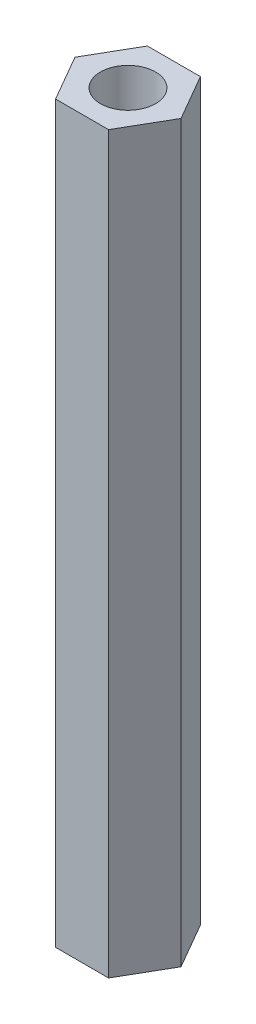
ISO-10303-21;
HEADER;
FILE_DESCRIPTION(('STEP AP214'),'2;1');
FILE_NAME('part.step','',(''),(''),'','','');
FILE_SCHEMA(('AUTOMOTIVE_DESIGN { 1 0 10303 214 1 1 1 1 }'));
ENDSEC;
DATA;
#1=APPLICATION_CONTEXT('core data for automotive mechanical design processes');
#2=APPLICATION_PROTOCOL_DEFINITION('international standard','automotive_design',2000,#1);
#3=PRODUCT_CONTEXT('',#1,'mechanical');
#4=PRODUCT('Part','Part','',(#3));
#5=PRODUCT_RELATED_PRODUCT_CATEGORY('part','',(#4));
#6=PRODUCT_DEFINITION_FORMATION('','',#4);
#7=PRODUCT_DEFINITION_CONTEXT('part definition',#1,'design');
#8=PRODUCT_DEFINITION('design','',#6,#7);
#9=PRODUCT_DEFINITION_SHAPE('','',#8);
#10=(LENGTH_UNIT() NAMED_UNIT(*) SI_UNIT(.MILLI.,.METRE.));
#11=(NAMED_UNIT(*) PLANE_ANGLE_UNIT() SI_UNIT($,.RADIAN.));
#12=(NAMED_UNIT(*) SI_UNIT($,.STERADIAN.) SOLID_ANGLE_UNIT());
#13=UNCERTAINTY_MEASURE_WITH_UNIT(LENGTH_MEASURE(1.E-05),#10,'distance_accuracy_value','');
#14=(GEOMETRIC_REPRESENTATION_CONTEXT(3) GLOBAL_UNCERTAINTY_ASSIGNED_CONTEXT((#13)) GLOBAL_UNIT_ASSIGNED_CONTEXT((#10,
#11,#12)) REPRESENTATION_CONTEXT('',''));
#15=CARTESIAN_POINT('',(0.,0.,0.));
#16=DIRECTION('',(0.,0.,1.));
#17=DIRECTION('',(1.,0.,0.));
#18=AXIS2_PLACEMENT_3D('',#15,#16,#17);
#19=CARTESIAN_POINT('',(1.44337567297407,20.,2.5));
#20=DIRECTION('',(-0.866025403784439,0.,-0.5));
#21=DIRECTION('',(-0.5,0.,0.866025403784439));
#22=AXIS2_PLACEMENT_3D('',#19,#20,#21);
#23=PLANE('',#22);
#24=DIRECTION('',(0.5,0.,-0.866025403784439));
#25=VECTOR('',#24,1.);
#26=CARTESIAN_POINT('',(1.44337567297407,-20.,2.5));
#27=LINE('',#26,#25);
#28=CARTESIAN_POINT('',(1.44337567297407,-20.,2.5));
#29=VERTEX_POINT('',#28);
#30=CARTESIAN_POINT('',(2.88675134594813,-20.,0.));
#31=VERTEX_POINT('',#30);
#32=EDGE_CURVE('E124',#29,#31,#27,.T.);
#33=ORIENTED_EDGE('',*,*,#32,.T.);
#34=DIRECTION('',(0.,-1.,0.));
#35=VECTOR('',#34,1.);
#36=CARTESIAN_POINT('',(2.88675134594813,20.,0.));
#37=LINE('',#36,#35);
#38=CARTESIAN_POINT('',(2.88675134594813,20.,0.));
#39=VERTEX_POINT('',#38);
#40=EDGE_CURVE('E11',#39,#31,#37,.T.);
#41=ORIENTED_EDGE('',*,*,#40,.F.);
#42=DIRECTION('',(0.5,0.,-0.866025403784439));
#43=VECTOR('',#42,1.);
#44=CARTESIAN_POINT('',(1.44337567297407,20.,2.5));
#45=LINE('',#44,#43);
#46=CARTESIAN_POINT('',(1.44337567297407,20.,2.5));
#47=VERTEX_POINT('',#46);
#48=EDGE_CURVE('E135',#47,#39,#45,.T.);
#49=ORIENTED_EDGE('',*,*,#48,.F.);
#50=DIRECTION('',(0.,-1.,0.));
#51=VECTOR('',#50,1.);
#52=CARTESIAN_POINT('',(1.44337567297407,20.,2.5));
#53=LINE('',#52,#51);
#54=EDGE_CURVE('E120',#47,#29,#53,.T.);
#55=ORIENTED_EDGE('',*,*,#54,.T.);
#56=EDGE_LOOP('',(#33,#41,#49,#55));
#57=FACE_BOUND('',#56,.T.);
#58=ADVANCED_FACE('F40',(#57),#23,.F.);
#59=CARTESIAN_POINT('',(2.88675134594813,20.,0.));
#60=DIRECTION('',(-0.866025403784438,0.,0.5));
#61=DIRECTION('',(0.5,0.,0.866025403784439));
#62=AXIS2_PLACEMENT_3D('',#59,#60,#61);
#63=PLANE('',#62);
#64=DIRECTION('',(-0.5,0.,-0.866025403784439));
#65=VECTOR('',#64,1.);
#66=CARTESIAN_POINT('',(2.88675134594813,-20.,0.));
#67=LINE('',#66,#65);
#68=CARTESIAN_POINT('',(1.44337567297406,-20.,-2.5));
#69=VERTEX_POINT('',#68);
#70=EDGE_CURVE('E127',#31,#69,#67,.T.);
#71=ORIENTED_EDGE('',*,*,#70,.T.);
#72=DIRECTION('',(0.,-1.,0.));
#73=VECTOR('',#72,1.);
#74=CARTESIAN_POINT('',(1.44337567297406,20.,-2.5));
#75=LINE('',#74,#73);
#76=CARTESIAN_POINT('',(1.44337567297406,20.,-2.5));
#77=VERTEX_POINT('',#76);
#78=EDGE_CURVE('E48',#77,#69,#75,.T.);
#79=ORIENTED_EDGE('',*,*,#78,.F.);
#80=DIRECTION('',(-0.5,0.,-0.866025403784439));
#81=VECTOR('',#80,1.);
#82=CARTESIAN_POINT('',(2.88675134594813,20.,0.));
#83=LINE('',#82,#81);
#84=EDGE_CURVE('E93',#39,#77,#83,.T.);
#85=ORIENTED_EDGE('',*,*,#84,.F.);
#86=ORIENTED_EDGE('',*,*,#40,.T.);
#87=EDGE_LOOP('',(#71,#79,#85,#86));
#88=FACE_BOUND('',#87,.T.);
#89=ADVANCED_FACE('F160',(#88),#63,.F.);
#90=CARTESIAN_POINT('',(1.44337567297406,20.,-2.5));
#91=DIRECTION('',(0.,0.,1.));
#92=DIRECTION('',(1.,0.,0.));
#93=AXIS2_PLACEMENT_3D('',#90,#91,#92);
#94=PLANE('',#93);
#95=DIRECTION('',(-1.,0.,0.));
#96=VECTOR('',#95,1.);
#97=CARTESIAN_POINT('',(1.44337567297406,-20.,-2.5));
#98=LINE('',#97,#96);
#99=CARTESIAN_POINT('',(-1.44337567297406,-20.,-2.5));
#100=VERTEX_POINT('',#99);
#101=EDGE_CURVE('E130',#69,#100,#98,.T.);
#102=ORIENTED_EDGE('',*,*,#101,.T.);
#103=DIRECTION('',(0.,-1.,0.));
#104=VECTOR('',#103,1.);
#105=CARTESIAN_POINT('',(-1.44337567297406,20.,-2.5));
#106=LINE('',#105,#104);
#107=CARTESIAN_POINT('',(-1.44337567297406,20.,-2.5));
#108=VERTEX_POINT('',#107);
#109=EDGE_CURVE('E115',#108,#100,#106,.T.);
#110=ORIENTED_EDGE('',*,*,#109,.F.);
#111=DIRECTION('',(-1.,0.,0.));
#112=VECTOR('',#111,1.);
#113=CARTESIAN_POINT('',(1.44337567297406,20.,-2.5));
#114=LINE('',#113,#112);
#115=EDGE_CURVE('E106',#77,#108,#114,.T.);
#116=ORIENTED_EDGE('',*,*,#115,.F.);
#117=ORIENTED_EDGE('',*,*,#78,.T.);
#118=EDGE_LOOP('',(#102,#110,#116,#117));
#119=FACE_BOUND('',#118,.T.);
#120=ADVANCED_FACE('F141',(#119),#94,.F.);
#121=CARTESIAN_POINT('',(-1.44337567297406,20.,-2.5));
#122=DIRECTION('',(0.866025403784439,0.,0.5));
#123=DIRECTION('',(0.5,0.,-0.866025403784439));
#124=AXIS2_PLACEMENT_3D('',#121,#122,#123);
#125=PLANE('',#124);
#126=DIRECTION('',(-0.5,0.,0.866025403784439));
#127=VECTOR('',#126,1.);
#128=CARTESIAN_POINT('',(-1.44337567297406,-20.,-2.5));
#129=LINE('',#128,#127);
#130=CARTESIAN_POINT('',(-2.88675134594813,-20.,0.));
#131=VERTEX_POINT('',#130);
#132=EDGE_CURVE('E114',#100,#131,#129,.T.);
#133=ORIENTED_EDGE('',*,*,#132,.T.);
#134=DIRECTION('',(0.,-1.,0.));
#135=VECTOR('',#134,1.);
#136=CARTESIAN_POINT('',(-2.88675134594813,20.,0.));
#137=LINE('',#136,#135);
#138=CARTESIAN_POINT('',(-2.88675134594813,20.,0.));
#139=VERTEX_POINT('',#138);
#140=EDGE_CURVE('E111',#139,#131,#137,.T.);
#141=ORIENTED_EDGE('',*,*,#140,.F.);
#142=DIRECTION('',(-0.5,0.,0.866025403784439));
#143=VECTOR('',#142,1.);
#144=CARTESIAN_POINT('',(-1.44337567297406,20.,-2.5));
#145=LINE('',#144,#143);
#146=EDGE_CURVE('E100',#108,#139,#145,.T.);
#147=ORIENTED_EDGE('',*,*,#146,.F.);
#148=ORIENTED_EDGE('',*,*,#109,.T.);
#149=EDGE_LOOP('',(#133,#141,#147,#148));
#150=FACE_BOUND('',#149,.T.);
#151=ADVANCED_FACE('F112',(#150),#125,.F.);
#152=CARTESIAN_POINT('',(-2.88675134594813,20.,0.));
#153=DIRECTION('',(0.866025403784438,0.,-0.5));
#154=DIRECTION('',(-0.5,0.,-0.866025403784439));
#155=AXIS2_PLACEMENT_3D('',#152,#153,#154);
#156=PLANE('',#155);
#157=DIRECTION('',(0.5,0.,0.866025403784439));
#158=VECTOR('',#157,1.);
#159=CARTESIAN_POINT('',(-2.88675134594813,-20.,0.));
#160=LINE('',#159,#158);
#161=CARTESIAN_POINT('',(-1.44337567297406,-20.,2.5));
#162=VERTEX_POINT('',#161);
#163=EDGE_CURVE('E79',#131,#162,#160,.T.);
#164=ORIENTED_EDGE('',*,*,#163,.T.);
#165=DIRECTION('',(0.,-1.,0.));
#166=VECTOR('',#165,1.);
#167=CARTESIAN_POINT('',(-1.44337567297406,20.,2.5));
#168=LINE('',#167,#166);
#169=CARTESIAN_POINT('',(-1.44337567297406,20.,2.5));
#170=VERTEX_POINT('',#169);
#171=EDGE_CURVE('E116',#170,#162,#168,.T.);
#172=ORIENTED_EDGE('',*,*,#171,.F.);
#173=DIRECTION('',(0.5,0.,0.866025403784439));
#174=VECTOR('',#173,1.);
#175=CARTESIAN_POINT('',(-2.88675134594813,20.,0.));
#176=LINE('',#175,#174);
#177=EDGE_CURVE('E104',#139,#170,#176,.T.);
#178=ORIENTED_EDGE('',*,*,#177,.F.);
#179=ORIENTED_EDGE('',*,*,#140,.T.);
#180=EDGE_LOOP('',(#164,#172,#178,#179));
#181=FACE_BOUND('',#180,.T.);
#182=ADVANCED_FACE('F118',(#181),#156,.F.);
#183=CARTESIAN_POINT('',(-1.44337567297406,20.,2.5));
#184=DIRECTION('',(0.,0.,-1.));
#185=DIRECTION('',(-1.,0.,0.));
#186=AXIS2_PLACEMENT_3D('',#183,#184,#185);
#187=PLANE('',#186);
#188=DIRECTION('',(1.,0.,0.));
#189=VECTOR('',#188,1.);
#190=CARTESIAN_POINT('',(-1.44337567297406,-20.,2.5));
#191=LINE('',#190,#189);
#192=EDGE_CURVE('E85',#162,#29,#191,.T.);
#193=ORIENTED_EDGE('',*,*,#192,.T.);
#194=ORIENTED_EDGE('',*,*,#54,.F.);
#195=DIRECTION('',(1.,0.,0.));
#196=VECTOR('',#195,1.);
#197=CARTESIAN_POINT('',(-1.44337567297406,20.,2.5));
#198=LINE('',#197,#196);
#199=EDGE_CURVE('E56',#170,#47,#198,.T.);
#200=ORIENTED_EDGE('',*,*,#199,.F.);
#201=ORIENTED_EDGE('',*,*,#171,.T.);
#202=EDGE_LOOP('',(#193,#194,#200,#201));
#203=FACE_BOUND('',#202,.T.);
#204=ADVANCED_FACE('F148',(#203),#187,.F.);
#205=CARTESIAN_POINT('',(0.,20.,0.));
#206=DIRECTION('',(0.,1.,0.));
#207=DIRECTION('',(0.,0.,1.));
#208=AXIS2_PLACEMENT_3D('',#205,#206,#207);
#209=PLANE('',#208);
#210=CARTESIAN_POINT('',(0.,20.,0.));
#211=DIRECTION('',(0.,1.,0.));
#212=DIRECTION('',(0.,0.,1.));
#213=AXIS2_PLACEMENT_3D('',#210,#211,#212);
#214=CIRCLE('',#213,1.5);
#215=CARTESIAN_POINT('',(0.,20.,1.5));
#216=VERTEX_POINT('',#215);
#217=EDGE_CURVE('E281',#216,#216,#214,.T.);
#218=ORIENTED_EDGE('',*,*,#217,.F.);
#219=EDGE_LOOP('',(#218));
#220=FACE_BOUND('',#219,.T.);
#221=ORIENTED_EDGE('',*,*,#48,.T.);
#222=ORIENTED_EDGE('',*,*,#84,.T.);
#223=ORIENTED_EDGE('',*,*,#115,.T.);
#224=ORIENTED_EDGE('',*,*,#146,.T.);
#225=ORIENTED_EDGE('',*,*,#177,.T.);
#226=ORIENTED_EDGE('',*,*,#199,.T.);
#227=EDGE_LOOP('',(#221,#222,#223,#224,#225,#226));
#228=FACE_BOUND('',#227,.T.);
#229=ADVANCED_FACE('F102',(#220,#228),#209,.T.);
#230=CARTESIAN_POINT('',(0.,-20.,0.));
#231=DIRECTION('',(0.,1.,0.));
#232=DIRECTION('',(0.,0.,1.));
#233=AXIS2_PLACEMENT_3D('',#230,#231,#232);
#234=PLANE('',#233);
#235=CARTESIAN_POINT('',(0.,-20.,0.));
#236=DIRECTION('',(0.,1.,0.));
#237=DIRECTION('',(0.,0.,1.));
#238=AXIS2_PLACEMENT_3D('',#235,#236,#237);
#239=CIRCLE('',#238,1.5);
#240=CARTESIAN_POINT('',(0.,-20.,1.5));
#241=VERTEX_POINT('',#240);
#242=EDGE_CURVE('E282',#241,#241,#239,.T.);
#243=ORIENTED_EDGE('',*,*,#242,.T.);
#244=EDGE_LOOP('',(#243));
#245=FACE_BOUND('',#244,.T.);
#246=ORIENTED_EDGE('',*,*,#32,.F.);
#247=ORIENTED_EDGE('',*,*,#192,.F.);
#248=ORIENTED_EDGE('',*,*,#163,.F.);
#249=ORIENTED_EDGE('',*,*,#132,.F.);
#250=ORIENTED_EDGE('',*,*,#101,.F.);
#251=ORIENTED_EDGE('',*,*,#70,.F.);
#252=EDGE_LOOP('',(#246,#247,#248,#249,#250,#251));
#253=FACE_BOUND('',#252,.T.);
#254=ADVANCED_FACE('F144',(#245,#253),#234,.F.);
#255=CARTESIAN_POINT('',(0.,14.,0.));
#256=DIRECTION('',(0.,1.,0.));
#257=DIRECTION('',(0.,0.,1.));
#258=AXIS2_PLACEMENT_3D('',#255,#256,#257);
#259=CYLINDRICAL_SURFACE('',#258,1.5);
#260=CARTESIAN_POINT('',(0.,14.,0.));
#261=DIRECTION('',(0.,1.,0.));
#262=DIRECTION('',(0.,0.,1.));
#263=AXIS2_PLACEMENT_3D('',#260,#261,#262);
#264=CIRCLE('',#263,1.5);
#265=CARTESIAN_POINT('',(0.,14.,1.5));
#266=VERTEX_POINT('',#265);
#267=EDGE_CURVE('E128',#266,#266,#264,.T.);
#268=ORIENTED_EDGE('',*,*,#267,.F.);
#269=EDGE_LOOP('',(#268));
#270=FACE_BOUND('',#269,.T.);
#271=ORIENTED_EDGE('',*,*,#217,.T.);
#272=EDGE_LOOP('',(#271));
#273=FACE_BOUND('',#272,.T.);
#274=ADVANCED_FACE('F198',(#270,#273),#259,.F.);
#275=CARTESIAN_POINT('',(0.,14.,0.));
#276=DIRECTION('',(0.,1.,0.));
#277=DIRECTION('',(0.,0.,1.));
#278=AXIS2_PLACEMENT_3D('',#275,#276,#277);
#279=PLANE('',#278);
#280=ORIENTED_EDGE('',*,*,#267,.T.);
#281=EDGE_LOOP('',(#280));
#282=FACE_BOUND('',#281,.T.);
#283=ADVANCED_FACE('F203',(#282),#279,.T.);
#284=CARTESIAN_POINT('',(0.,-14.,0.));
#285=DIRECTION('',(0.,-1.,0.));
#286=DIRECTION('',(0.,0.,-1.));
#287=AXIS2_PLACEMENT_3D('',#284,#285,#286);
#288=CYLINDRICAL_SURFACE('',#287,1.5);
#289=CARTESIAN_POINT('',(0.,-14.,0.));
#290=DIRECTION('',(0.,1.,0.));
#291=DIRECTION('',(0.,0.,1.));
#292=AXIS2_PLACEMENT_3D('',#289,#290,#291);
#293=CIRCLE('',#292,1.5);
#294=CARTESIAN_POINT('',(0.,-14.,1.5));
#295=VERTEX_POINT('',#294);
#296=EDGE_CURVE('E280',#295,#295,#293,.T.);
#297=ORIENTED_EDGE('',*,*,#296,.T.);
#298=EDGE_LOOP('',(#297));
#299=FACE_BOUND('',#298,.T.);
#300=ORIENTED_EDGE('',*,*,#242,.F.);
#301=EDGE_LOOP('',(#300));
#302=FACE_BOUND('',#301,.T.);
#303=ADVANCED_FACE('F214',(#299,#302),#288,.F.);
#304=CARTESIAN_POINT('',(0.,-14.,0.));
#305=DIRECTION('',(0.,-1.,0.));
#306=DIRECTION('',(0.,0.,1.));
#307=AXIS2_PLACEMENT_3D('',#304,#305,#306);
#308=PLANE('',#307);
#309=ORIENTED_EDGE('',*,*,#296,.F.);
#310=EDGE_LOOP('',(#309));
#311=FACE_BOUND('',#310,.T.);
#312=ADVANCED_FACE('F232',(#311),#308,.T.);
#313=CLOSED_SHELL('',(#58,#89,#120,#151,#182,#204,#229,#254,#274,#283,#303,#312));
#314=MANIFOLD_SOLID_BREP('B2',#313);
#315=ADVANCED_BREP_SHAPE_REPRESENTATION('',(#18,#314),#14);
#316=SHAPE_DEFINITION_REPRESENTATION(#9,#315);
ENDSEC;
END-ISO-10303-21;
